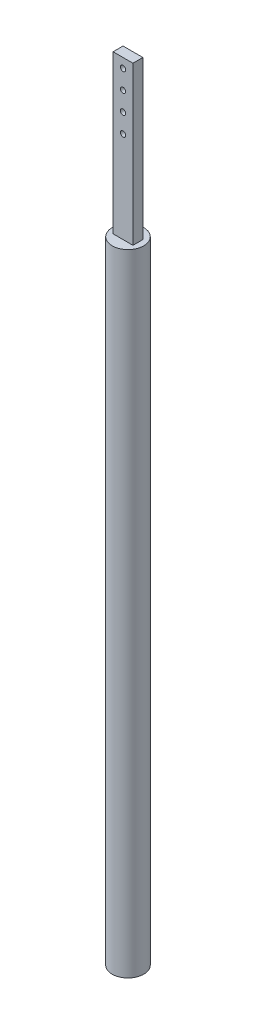
ISO-10303-21;
HEADER;
FILE_DESCRIPTION(('STEP AP214'),'2;1');
FILE_NAME('part.step','',(''),(''),'','','');
FILE_SCHEMA(('AUTOMOTIVE_DESIGN { 1 0 10303 214 1 1 1 1 }'));
ENDSEC;
DATA;
#1=APPLICATION_CONTEXT('core data for automotive mechanical design processes');
#2=APPLICATION_PROTOCOL_DEFINITION('international standard','automotive_design',2000,#1);
#3=PRODUCT_CONTEXT('',#1,'mechanical');
#4=PRODUCT('Part','Part','',(#3));
#5=PRODUCT_RELATED_PRODUCT_CATEGORY('part','',(#4));
#6=PRODUCT_DEFINITION_FORMATION('','',#4);
#7=PRODUCT_DEFINITION_CONTEXT('part definition',#1,'design');
#8=PRODUCT_DEFINITION('design','',#6,#7);
#9=PRODUCT_DEFINITION_SHAPE('','',#8);
#10=(LENGTH_UNIT() NAMED_UNIT(*) SI_UNIT(.MILLI.,.METRE.));
#11=(NAMED_UNIT(*) PLANE_ANGLE_UNIT() SI_UNIT($,.RADIAN.));
#12=(NAMED_UNIT(*) SI_UNIT($,.STERADIAN.) SOLID_ANGLE_UNIT());
#13=UNCERTAINTY_MEASURE_WITH_UNIT(LENGTH_MEASURE(1.E-05),#10,'distance_accuracy_value','');
#14=(GEOMETRIC_REPRESENTATION_CONTEXT(3) GLOBAL_UNCERTAINTY_ASSIGNED_CONTEXT((#13)) GLOBAL_UNIT_ASSIGNED_CONTEXT((#10,
#11,#12)) REPRESENTATION_CONTEXT('',''));
#15=CARTESIAN_POINT('',(0.,0.,0.));
#16=DIRECTION('',(0.,0.,1.));
#17=DIRECTION('',(1.,0.,0.));
#18=AXIS2_PLACEMENT_3D('',#15,#16,#17);
#19=CARTESIAN_POINT('',(0.,127.,0.));
#20=DIRECTION('',(0.,-1.,0.));
#21=DIRECTION('',(0.,0.,-1.));
#22=AXIS2_PLACEMENT_3D('',#19,#20,#21);
#23=CYLINDRICAL_SURFACE('',#22,3.175);
#24=CARTESIAN_POINT('',(0.,127.,0.));
#25=DIRECTION('',(0.,1.,0.));
#26=DIRECTION('',(0.,0.,1.));
#27=AXIS2_PLACEMENT_3D('',#24,#25,#26);
#28=CIRCLE('',#27,3.175);
#29=CARTESIAN_POINT('',(0.,127.,3.175));
#30=VERTEX_POINT('',#29);
#31=EDGE_CURVE('E11',#30,#30,#28,.T.);
#32=ORIENTED_EDGE('',*,*,#31,.F.);
#33=EDGE_LOOP('',(#32));
#34=FACE_BOUND('',#33,.T.);
#35=CARTESIAN_POINT('',(0.,0.,0.));
#36=DIRECTION('',(0.,1.,0.));
#37=DIRECTION('',(0.,0.,1.));
#38=AXIS2_PLACEMENT_3D('',#35,#36,#37);
#39=CIRCLE('',#38,3.175);
#40=CARTESIAN_POINT('',(0.,0.,3.175));
#41=VERTEX_POINT('',#40);
#42=EDGE_CURVE('E40',#41,#41,#39,.T.);
#43=ORIENTED_EDGE('',*,*,#42,.T.);
#44=EDGE_LOOP('',(#43));
#45=FACE_BOUND('',#44,.T.);
#46=ADVANCED_FACE('F37',(#34,#45),#23,.T.);
#47=CARTESIAN_POINT('',(0.,127.,0.));
#48=DIRECTION('',(0.,1.,0.));
#49=DIRECTION('',(0.,0.,1.));
#50=AXIS2_PLACEMENT_3D('',#47,#48,#49);
#51=PLANE('',#50);
#52=DIRECTION('',(-1.,0.,0.));
#53=VECTOR('',#52,1.);
#54=CARTESIAN_POINT('',(2.000000128,127.,-1.));
#55=LINE('',#54,#53);
#56=CARTESIAN_POINT('',(2.000000128,127.,-1.));
#57=VERTEX_POINT('',#56);
#58=CARTESIAN_POINT('',(-2.,127.,-1.));
#59=VERTEX_POINT('',#58);
#60=EDGE_CURVE('E51',#57,#59,#55,.T.);
#61=ORIENTED_EDGE('',*,*,#60,.F.);
#62=DIRECTION('',(0.,0.,-1.));
#63=VECTOR('',#62,1.);
#64=CARTESIAN_POINT('',(2.000000128,127.,1.));
#65=LINE('',#64,#63);
#66=CARTESIAN_POINT('',(2.000000128,127.,1.));
#67=VERTEX_POINT('',#66);
#68=EDGE_CURVE('E55',#67,#57,#65,.T.);
#69=ORIENTED_EDGE('',*,*,#68,.F.);
#70=DIRECTION('',(1.,0.,0.));
#71=VECTOR('',#70,1.);
#72=CARTESIAN_POINT('',(-2.,127.,1.));
#73=LINE('',#72,#71);
#74=CARTESIAN_POINT('',(-2.,127.,1.));
#75=VERTEX_POINT('',#74);
#76=EDGE_CURVE('E107',#75,#67,#73,.T.);
#77=ORIENTED_EDGE('',*,*,#76,.F.);
#78=DIRECTION('',(0.,0.,1.));
#79=VECTOR('',#78,1.);
#80=CARTESIAN_POINT('',(-2.,127.,-1.));
#81=LINE('',#80,#79);
#82=EDGE_CURVE('E109',#59,#75,#81,.T.);
#83=ORIENTED_EDGE('',*,*,#82,.F.);
#84=EDGE_LOOP('',(#61,#69,#77,#83));
#85=FACE_BOUND('',#84,.T.);
#86=ORIENTED_EDGE('',*,*,#31,.T.);
#87=EDGE_LOOP('',(#86));
#88=FACE_BOUND('',#87,.T.);
#89=ADVANCED_FACE('F164',(#85,#88),#51,.T.);
#90=CARTESIAN_POINT('',(0.,0.,0.));
#91=DIRECTION('',(0.,1.,0.));
#92=DIRECTION('',(0.,0.,1.));
#93=AXIS2_PLACEMENT_3D('',#90,#91,#92);
#94=PLANE('',#93);
#95=ORIENTED_EDGE('',*,*,#42,.F.);
#96=EDGE_LOOP('',(#95));
#97=FACE_BOUND('',#96,.T.);
#98=ADVANCED_FACE('F143',(#97),#94,.F.);
#99=CARTESIAN_POINT('',(2.000000128,158.75,-1.));
#100=DIRECTION('',(0.,0.,1.));
#101=DIRECTION('',(1.,0.,0.));
#102=AXIS2_PLACEMENT_3D('',#99,#100,#101);
#103=PLANE('',#102);
#104=CARTESIAN_POINT('',(1.66262403150999E-12,156.845,-1.));
#105=DIRECTION('',(0.,0.,-1.));
#106=DIRECTION('',(-1.,0.,0.));
#107=AXIS2_PLACEMENT_3D('',#104,#105,#106);
#108=CIRCLE('',#107,0.533399999999992);
#109=CARTESIAN_POINT('',(-0.53339999999833,156.845,-1.));
#110=VERTEX_POINT('',#109);
#111=EDGE_CURVE('E124',#110,#110,#108,.T.);
#112=ORIENTED_EDGE('',*,*,#111,.F.);
#113=EDGE_LOOP('',(#112));
#114=FACE_BOUND('',#113,.T.);
#115=CARTESIAN_POINT('',(1.54290113640106E-12,145.415,-1.));
#116=DIRECTION('',(0.,0.,-1.));
#117=DIRECTION('',(-1.,0.,0.));
#118=AXIS2_PLACEMENT_3D('',#115,#116,#117);
#119=CIRCLE('',#118,0.533399999999992);
#120=CARTESIAN_POINT('',(-0.533399999998449,145.415,-1.));
#121=VERTEX_POINT('',#120);
#122=EDGE_CURVE('E130',#121,#121,#119,.T.);
#123=ORIENTED_EDGE('',*,*,#122,.F.);
#124=EDGE_LOOP('',(#123));
#125=FACE_BOUND('',#124,.T.);
#126=CARTESIAN_POINT('',(1.58280876810404E-12,149.225,-1.));
#127=DIRECTION('',(0.,0.,-1.));
#128=DIRECTION('',(-1.,0.,0.));
#129=AXIS2_PLACEMENT_3D('',#126,#127,#128);
#130=CIRCLE('',#129,0.533399999999992);
#131=CARTESIAN_POINT('',(-0.533399999998409,149.225,-1.));
#132=VERTEX_POINT('',#131);
#133=EDGE_CURVE('E118',#132,#132,#130,.T.);
#134=ORIENTED_EDGE('',*,*,#133,.F.);
#135=EDGE_LOOP('',(#134));
#136=FACE_BOUND('',#135,.T.);
#137=CARTESIAN_POINT('',(1.62271639980701E-12,153.035,-1.));
#138=DIRECTION('',(0.,0.,-1.));
#139=DIRECTION('',(-1.,0.,0.));
#140=AXIS2_PLACEMENT_3D('',#137,#138,#139);
#141=CIRCLE('',#140,0.533399999999992);
#142=CARTESIAN_POINT('',(-0.53339999999837,153.035,-1.));
#143=VERTEX_POINT('',#142);
#144=EDGE_CURVE('E115',#143,#143,#141,.T.);
#145=ORIENTED_EDGE('',*,*,#144,.F.);
#146=EDGE_LOOP('',(#145));
#147=FACE_BOUND('',#146,.T.);
#148=ORIENTED_EDGE('',*,*,#60,.T.);
#149=DIRECTION('',(0.,-1.,0.));
#150=VECTOR('',#149,1.);
#151=CARTESIAN_POINT('',(-2.,158.75,-1.));
#152=LINE('',#151,#150);
#153=CARTESIAN_POINT('',(-2.,158.75,-1.));
#154=VERTEX_POINT('',#153);
#155=EDGE_CURVE('E80',#154,#59,#152,.T.);
#156=ORIENTED_EDGE('',*,*,#155,.F.);
#157=DIRECTION('',(-1.,0.,0.));
#158=VECTOR('',#157,1.);
#159=CARTESIAN_POINT('',(2.000000128,158.75,-1.));
#160=LINE('',#159,#158);
#161=CARTESIAN_POINT('',(2.000000128,158.75,-1.));
#162=VERTEX_POINT('',#161);
#163=EDGE_CURVE('E86',#162,#154,#160,.T.);
#164=ORIENTED_EDGE('',*,*,#163,.F.);
#165=DIRECTION('',(0.,-1.,0.));
#166=VECTOR('',#165,1.);
#167=CARTESIAN_POINT('',(2.000000128,158.75,-1.));
#168=LINE('',#167,#166);
#169=EDGE_CURVE('E104',#162,#57,#168,.T.);
#170=ORIENTED_EDGE('',*,*,#169,.T.);
#171=EDGE_LOOP('',(#148,#156,#164,#170));
#172=FACE_BOUND('',#171,.T.);
#173=ADVANCED_FACE('F96',(#114,#125,#136,#147,#172),#103,.F.);
#174=CARTESIAN_POINT('',(-2.,158.75,-1.));
#175=DIRECTION('',(1.,0.,0.));
#176=DIRECTION('',(0.,0.,-1.));
#177=AXIS2_PLACEMENT_3D('',#174,#175,#176);
#178=PLANE('',#177);
#179=ORIENTED_EDGE('',*,*,#82,.T.);
#180=DIRECTION('',(0.,-1.,0.));
#181=VECTOR('',#180,1.);
#182=CARTESIAN_POINT('',(-2.,158.75,1.));
#183=LINE('',#182,#181);
#184=CARTESIAN_POINT('',(-2.,158.75,1.));
#185=VERTEX_POINT('',#184);
#186=EDGE_CURVE('E82',#185,#75,#183,.T.);
#187=ORIENTED_EDGE('',*,*,#186,.F.);
#188=DIRECTION('',(0.,0.,1.));
#189=VECTOR('',#188,1.);
#190=CARTESIAN_POINT('',(-2.,158.75,-1.));
#191=LINE('',#190,#189);
#192=EDGE_CURVE('E75',#154,#185,#191,.T.);
#193=ORIENTED_EDGE('',*,*,#192,.F.);
#194=ORIENTED_EDGE('',*,*,#155,.T.);
#195=EDGE_LOOP('',(#179,#187,#193,#194));
#196=FACE_BOUND('',#195,.T.);
#197=ADVANCED_FACE('F78',(#196),#178,.F.);
#198=CARTESIAN_POINT('',(-2.,158.75,1.));
#199=DIRECTION('',(0.,0.,-1.));
#200=DIRECTION('',(-1.,0.,0.));
#201=AXIS2_PLACEMENT_3D('',#198,#199,#200);
#202=PLANE('',#201);
#203=CARTESIAN_POINT('',(1.66284087193755E-12,156.845,1.));
#204=DIRECTION('',(0.,0.,-1.));
#205=DIRECTION('',(-1.,0.,0.));
#206=AXIS2_PLACEMENT_3D('',#203,#204,#205);
#207=CIRCLE('',#206,0.533399999999992);
#208=CARTESIAN_POINT('',(-0.533399999998329,156.845,1.));
#209=VERTEX_POINT('',#208);
#210=EDGE_CURVE('E121',#209,#209,#207,.T.);
#211=ORIENTED_EDGE('',*,*,#210,.T.);
#212=EDGE_LOOP('',(#211));
#213=FACE_BOUND('',#212,.T.);
#214=CARTESIAN_POINT('',(1.54311797682862E-12,145.415,1.));
#215=DIRECTION('',(0.,0.,-1.));
#216=DIRECTION('',(-1.,0.,0.));
#217=AXIS2_PLACEMENT_3D('',#214,#215,#216);
#218=CIRCLE('',#217,0.533399999999992);
#219=CARTESIAN_POINT('',(-0.533399999998449,145.415,1.));
#220=VERTEX_POINT('',#219);
#221=EDGE_CURVE('E127',#220,#220,#218,.T.);
#222=ORIENTED_EDGE('',*,*,#221,.T.);
#223=EDGE_LOOP('',(#222));
#224=FACE_BOUND('',#223,.T.);
#225=CARTESIAN_POINT('',(1.5830256085316E-12,149.225,1.));
#226=DIRECTION('',(0.,0.,-1.));
#227=DIRECTION('',(-1.,0.,0.));
#228=AXIS2_PLACEMENT_3D('',#225,#226,#227);
#229=CIRCLE('',#228,0.533399999999992);
#230=CARTESIAN_POINT('',(-0.533399999998409,149.225,1.));
#231=VERTEX_POINT('',#230);
#232=EDGE_CURVE('E133',#231,#231,#229,.T.);
#233=ORIENTED_EDGE('',*,*,#232,.T.);
#234=EDGE_LOOP('',(#233));
#235=FACE_BOUND('',#234,.T.);
#236=CARTESIAN_POINT('',(1.62293324023457E-12,153.035,1.));
#237=DIRECTION('',(0.,0.,-1.));
#238=DIRECTION('',(-1.,0.,0.));
#239=AXIS2_PLACEMENT_3D('',#236,#237,#238);
#240=CIRCLE('',#239,0.533399999999992);
#241=CARTESIAN_POINT('',(-0.533399999998369,153.035,1.));
#242=VERTEX_POINT('',#241);
#243=EDGE_CURVE('E112',#242,#242,#240,.T.);
#244=ORIENTED_EDGE('',*,*,#243,.T.);
#245=EDGE_LOOP('',(#244));
#246=FACE_BOUND('',#245,.T.);
#247=ORIENTED_EDGE('',*,*,#76,.T.);
#248=DIRECTION('',(0.,-1.,0.));
#249=VECTOR('',#248,1.);
#250=CARTESIAN_POINT('',(2.000000128,158.75,1.));
#251=LINE('',#250,#249);
#252=CARTESIAN_POINT('',(2.000000128,158.75,1.));
#253=VERTEX_POINT('',#252);
#254=EDGE_CURVE('E99',#253,#67,#251,.T.);
#255=ORIENTED_EDGE('',*,*,#254,.F.);
#256=DIRECTION('',(1.,0.,0.));
#257=VECTOR('',#256,1.);
#258=CARTESIAN_POINT('',(-2.,158.75,1.));
#259=LINE('',#258,#257);
#260=EDGE_CURVE('E85',#185,#253,#259,.T.);
#261=ORIENTED_EDGE('',*,*,#260,.F.);
#262=ORIENTED_EDGE('',*,*,#186,.T.);
#263=EDGE_LOOP('',(#247,#255,#261,#262));
#264=FACE_BOUND('',#263,.T.);
#265=ADVANCED_FACE('F180',(#213,#224,#235,#246,#264),#202,.F.);
#266=CARTESIAN_POINT('',(2.000000128,158.75,1.));
#267=DIRECTION('',(-1.,0.,0.));
#268=DIRECTION('',(0.,0.,1.));
#269=AXIS2_PLACEMENT_3D('',#266,#267,#268);
#270=PLANE('',#269);
#271=ORIENTED_EDGE('',*,*,#68,.T.);
#272=ORIENTED_EDGE('',*,*,#169,.F.);
#273=DIRECTION('',(0.,0.,-1.));
#274=VECTOR('',#273,1.);
#275=CARTESIAN_POINT('',(2.000000128,158.75,1.));
#276=LINE('',#275,#274);
#277=EDGE_CURVE('E91',#253,#162,#276,.T.);
#278=ORIENTED_EDGE('',*,*,#277,.F.);
#279=ORIENTED_EDGE('',*,*,#254,.T.);
#280=EDGE_LOOP('',(#271,#272,#278,#279));
#281=FACE_BOUND('',#280,.T.);
#282=ADVANCED_FACE('F159',(#281),#270,.F.);
#283=CARTESIAN_POINT('',(0.,158.75,0.));
#284=DIRECTION('',(0.,1.,0.));
#285=DIRECTION('',(0.,0.,1.));
#286=AXIS2_PLACEMENT_3D('',#283,#284,#285);
#287=PLANE('',#286);
#288=ORIENTED_EDGE('',*,*,#163,.T.);
#289=ORIENTED_EDGE('',*,*,#192,.T.);
#290=ORIENTED_EDGE('',*,*,#260,.T.);
#291=ORIENTED_EDGE('',*,*,#277,.T.);
#292=EDGE_LOOP('',(#288,#289,#290,#291));
#293=FACE_BOUND('',#292,.T.);
#294=ADVANCED_FACE('F89',(#293),#287,.T.);
#295=CARTESIAN_POINT('',(1.62293324023457E-12,153.035,1.));
#296=DIRECTION('',(0.,0.,-1.));
#297=DIRECTION('',(-1.,0.,0.));
#298=AXIS2_PLACEMENT_3D('',#295,#296,#297);
#299=CYLINDRICAL_SURFACE('',#298,0.533399999999992);
#300=ORIENTED_EDGE('',*,*,#243,.F.);
#301=EDGE_LOOP('',(#300));
#302=FACE_BOUND('',#301,.T.);
#303=ORIENTED_EDGE('',*,*,#144,.T.);
#304=EDGE_LOOP('',(#303));
#305=FACE_BOUND('',#304,.T.);
#306=ADVANCED_FACE('F148',(#302,#305),#299,.F.);
#307=CARTESIAN_POINT('',(1.5830256085316E-12,149.225,1.));
#308=DIRECTION('',(0.,0.,-1.));
#309=DIRECTION('',(-1.,0.,0.));
#310=AXIS2_PLACEMENT_3D('',#307,#308,#309);
#311=CYLINDRICAL_SURFACE('',#310,0.533399999999992);
#312=ORIENTED_EDGE('',*,*,#232,.F.);
#313=EDGE_LOOP('',(#312));
#314=FACE_BOUND('',#313,.T.);
#315=ORIENTED_EDGE('',*,*,#133,.T.);
#316=EDGE_LOOP('',(#315));
#317=FACE_BOUND('',#316,.T.);
#318=ADVANCED_FACE('F139',(#314,#317),#311,.F.);
#319=CARTESIAN_POINT('',(1.54311797682862E-12,145.415,1.));
#320=DIRECTION('',(0.,0.,-1.));
#321=DIRECTION('',(-1.,0.,0.));
#322=AXIS2_PLACEMENT_3D('',#319,#320,#321);
#323=CYLINDRICAL_SURFACE('',#322,0.533399999999992);
#324=ORIENTED_EDGE('',*,*,#221,.F.);
#325=EDGE_LOOP('',(#324));
#326=FACE_BOUND('',#325,.T.);
#327=ORIENTED_EDGE('',*,*,#122,.T.);
#328=EDGE_LOOP('',(#327));
#329=FACE_BOUND('',#328,.T.);
#330=ADVANCED_FACE('F156',(#326,#329),#323,.F.);
#331=CARTESIAN_POINT('',(1.66284087193755E-12,156.845,1.));
#332=DIRECTION('',(0.,0.,-1.));
#333=DIRECTION('',(-1.,0.,0.));
#334=AXIS2_PLACEMENT_3D('',#331,#332,#333);
#335=CYLINDRICAL_SURFACE('',#334,0.533399999999992);
#336=ORIENTED_EDGE('',*,*,#210,.F.);
#337=EDGE_LOOP('',(#336));
#338=FACE_BOUND('',#337,.T.);
#339=ORIENTED_EDGE('',*,*,#111,.T.);
#340=EDGE_LOOP('',(#339));
#341=FACE_BOUND('',#340,.T.);
#342=ADVANCED_FACE('F229',(#338,#341),#335,.F.);
#343=CLOSED_SHELL('',(#46,#89,#98,#173,#197,#265,#282,#294,#306,#318,#330,#342));
#344=MANIFOLD_SOLID_BREP('B2',#343);
#345=ADVANCED_BREP_SHAPE_REPRESENTATION('',(#18,#344),#14);
#346=SHAPE_DEFINITION_REPRESENTATION(#9,#345);
ENDSEC;
END-ISO-10303-21;
